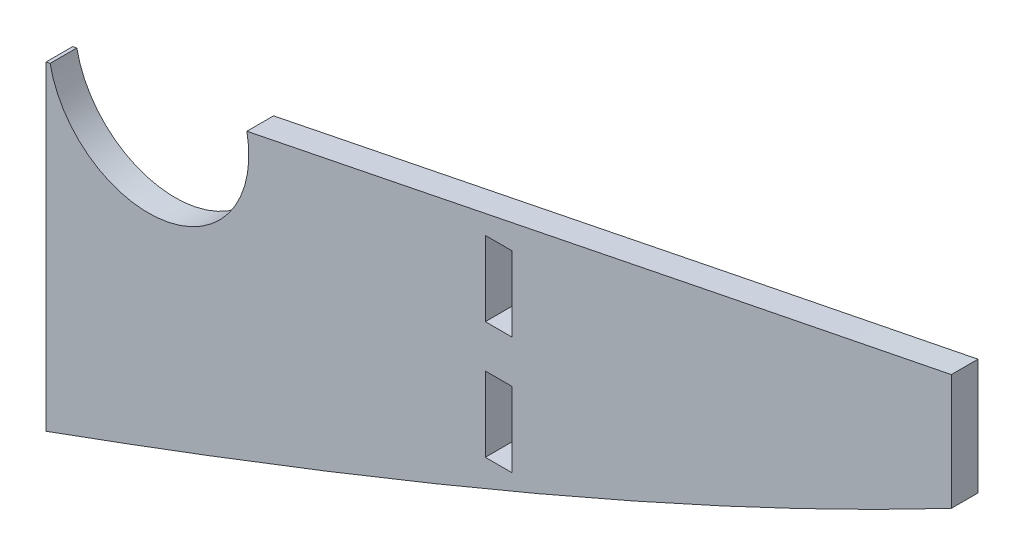
ISO-10303-21;
HEADER;
FILE_DESCRIPTION(('STEP AP214'),'2;1');
FILE_NAME('part.step','',(''),(''),'','','');
FILE_SCHEMA(('AUTOMOTIVE_DESIGN { 1 0 10303 214 1 1 1 1 }'));
ENDSEC;
DATA;
#1=APPLICATION_CONTEXT('core data for automotive mechanical design processes');
#2=APPLICATION_PROTOCOL_DEFINITION('international standard','automotive_design',2000,#1);
#3=PRODUCT_CONTEXT('',#1,'mechanical');
#4=PRODUCT('Part','Part','',(#3));
#5=PRODUCT_RELATED_PRODUCT_CATEGORY('part','',(#4));
#6=PRODUCT_DEFINITION_FORMATION('','',#4);
#7=PRODUCT_DEFINITION_CONTEXT('part definition',#1,'design');
#8=PRODUCT_DEFINITION('design','',#6,#7);
#9=PRODUCT_DEFINITION_SHAPE('','',#8);
#10=(LENGTH_UNIT() NAMED_UNIT(*) SI_UNIT(.MILLI.,.METRE.));
#11=(NAMED_UNIT(*) PLANE_ANGLE_UNIT() SI_UNIT($,.RADIAN.));
#12=(NAMED_UNIT(*) SI_UNIT($,.STERADIAN.) SOLID_ANGLE_UNIT());
#13=UNCERTAINTY_MEASURE_WITH_UNIT(LENGTH_MEASURE(1.E-05),#10,'distance_accuracy_value','');
#14=(GEOMETRIC_REPRESENTATION_CONTEXT(3) GLOBAL_UNCERTAINTY_ASSIGNED_CONTEXT((#13)) GLOBAL_UNIT_ASSIGNED_CONTEXT((#10,
#11,#12)) REPRESENTATION_CONTEXT('',''));
#15=CARTESIAN_POINT('',(0.,0.,0.));
#16=DIRECTION('',(0.,0.,1.));
#17=DIRECTION('',(1.,0.,0.));
#18=AXIS2_PLACEMENT_3D('',#15,#16,#17);
#19=CARTESIAN_POINT('',(374.396000000001,4.52327518462254E-12,-649.396489798407));
#20=DIRECTION('',(-1.,0.,0.));
#21=DIRECTION('',(0.,-1.,0.));
#22=AXIS2_PLACEMENT_3D('',#19,#20,#21);
#23=PLANE('',#22);
#24=DIRECTION('',(0.,1.,0.));
#25=VECTOR('',#24,1.);
#26=CARTESIAN_POINT('',(374.396000000001,4.52327518462254E-12,-652.571489798407));
#27=LINE('',#26,#25);
#28=CARTESIAN_POINT('',(374.396000000001,22.1319364735619,-652.571489798407));
#29=VERTEX_POINT('',#28);
#30=CARTESIAN_POINT('',(374.396000000001,35.9160765897987,-652.571489798407));
#31=VERTEX_POINT('',#30);
#32=EDGE_CURVE('E168',#29,#31,#27,.T.);
#33=ORIENTED_EDGE('',*,*,#32,.T.);
#34=DIRECTION('',(0.,0.,-1.));
#35=VECTOR('',#34,1.);
#36=CARTESIAN_POINT('',(374.396000000001,35.9160765897987,-649.396489798407));
#37=LINE('',#36,#35);
#38=CARTESIAN_POINT('',(374.396000000001,35.9160765897987,-649.396489798407));
#39=VERTEX_POINT('',#38);
#40=EDGE_CURVE('E290',#39,#31,#37,.T.);
#41=ORIENTED_EDGE('',*,*,#40,.F.);
#42=DIRECTION('',(0.,1.,0.));
#43=VECTOR('',#42,1.);
#44=CARTESIAN_POINT('',(374.396000000001,4.52327518462254E-12,-649.396489798407));
#45=LINE('',#44,#43);
#46=CARTESIAN_POINT('',(374.396000000001,22.1319364735619,-649.396489798407));
#47=VERTEX_POINT('',#46);
#48=EDGE_CURVE('E294',#47,#39,#45,.T.);
#49=ORIENTED_EDGE('',*,*,#48,.F.);
#50=DIRECTION('',(0.,0.,-1.));
#51=VECTOR('',#50,1.);
#52=CARTESIAN_POINT('',(374.396000000001,22.1319364735619,-649.396489798407));
#53=LINE('',#52,#51);
#54=EDGE_CURVE('E323',#47,#29,#53,.T.);
#55=ORIENTED_EDGE('',*,*,#54,.T.);
#56=EDGE_LOOP('',(#33,#41,#49,#55));
#57=FACE_BOUND('',#56,.T.);
#58=ADVANCED_FACE('F37',(#57),#23,.F.);
#59=CARTESIAN_POINT('',(374.396000000001,35.9160765897987,-649.396489798407));
#60=CARTESIAN_POINT('',(360.350473034592,33.1320534399722,-649.396489798407));
#61=CARTESIAN_POINT('',(346.312147582397,30.3120887584574,-649.396489798407));
#62=CARTESIAN_POINT('',(318.237676110703,24.6612822162992,-649.396489798407));
#63=CARTESIAN_POINT('',(304.201813174372,21.8290370005057,-649.396489798407));
#64=CARTESIAN_POINT('',(290.165193943975,19.0005565911736,-649.396489798407));
#65=B_SPLINE_CURVE_WITH_KNOTS('',3,(#59,#60,#61,#62,#63,#64),.UNSPECIFIED.,.F.,.F.,(4,2,4),(0.,
0.5,1.),.UNSPECIFIED.);
#66=DIRECTION('',(0.,0.,-1.));
#67=VECTOR('',#66,1.);
#68=SURFACE_OF_LINEAR_EXTRUSION('',#65,#67);
#69=CARTESIAN_POINT('',(374.396000000001,35.9160765897987,-652.571489798407));
#70=CARTESIAN_POINT('',(360.350473034592,33.1320534399722,-652.571489798407));
#71=CARTESIAN_POINT('',(346.312147582397,30.3120887584574,-652.571489798407));
#72=CARTESIAN_POINT('',(318.381505150183,24.6902320071463,-652.571489798407));
#73=CARTESIAN_POINT('',(304.489443265361,21.8870760724583,-652.571489798407));
#74=CARTESIAN_POINT('',(290.596661875897,19.0875017254489,-652.571489798407));
#75=B_SPLINE_CURVE_WITH_KNOTS('',3,(#69,#70,#71,#72,#73,#74),.UNSPECIFIED.,.F.,.F.,(4,2,4),(0.,
0.5,0.994876874543293),.UNSPECIFIED.);
#76=CARTESIAN_POINT('',(290.596661875897,19.087501725449,-652.571489798407));
#77=VERTEX_POINT('',#76);
#78=EDGE_CURVE('E227',#31,#77,#75,.T.);
#79=ORIENTED_EDGE('',*,*,#78,.T.);
#80=DIRECTION('',(0.,0.,-1.));
#81=VECTOR('',#80,1.);
#82=CARTESIAN_POINT('',(290.596661875897,19.087501725449,-649.396489798407));
#83=LINE('',#82,#81);
#84=CARTESIAN_POINT('',(290.596661875897,19.087501725449,-649.396489798407));
#85=VERTEX_POINT('',#84);
#86=EDGE_CURVE('E291',#85,#77,#83,.T.);
#87=ORIENTED_EDGE('',*,*,#86,.F.);
#88=CARTESIAN_POINT('',(290.596661875897,19.0875017254489,-649.396489798407));
#89=CARTESIAN_POINT('',(304.489443265361,21.8870760724583,-649.396489798407));
#90=CARTESIAN_POINT('',(318.381505150183,24.6902320071463,-649.396489798407));
#91=CARTESIAN_POINT('',(346.312147582397,30.3120887584574,-649.396489798407));
#92=CARTESIAN_POINT('',(360.350473034592,33.1320534399722,-649.396489798407));
#93=CARTESIAN_POINT('',(374.396000000001,35.9160765897987,-649.396489798407));
#94=B_SPLINE_CURVE_WITH_KNOTS('',3,(#88,#89,#90,#91,#92,#93),.UNSPECIFIED.,.F.,.F.,(4,2,4),(0.,
0.494876874543293,0.994876874543293),.UNSPECIFIED.);
#95=EDGE_CURVE('E280',#39,#85,#94,.F.);
#96=ORIENTED_EDGE('',*,*,#95,.F.);
#97=ORIENTED_EDGE('',*,*,#40,.T.);
#98=EDGE_LOOP('',(#79,#87,#96,#97));
#99=FACE_BOUND('',#98,.T.);
#100=ADVANCED_FACE('F198',(#99),#68,.F.);
#101=CARTESIAN_POINT('',(278.892,16.7387287753927,-649.396489798407));
#102=DIRECTION('',(0.,0.,-1.));
#103=DIRECTION('',(-1.,0.,0.));
#104=AXIS2_PLACEMENT_3D('',#101,#102,#103);
#105=CYLINDRICAL_SURFACE('',#104,11.9379999999999);
#106=CARTESIAN_POINT('',(278.892,16.7387287753927,-652.571489798407));
#107=DIRECTION('',(0.,0.,1.));
#108=DIRECTION('',(1.,0.,0.));
#109=AXIS2_PLACEMENT_3D('',#106,#107,#108);
#110=CIRCLE('',#109,11.9379999999999);
#111=CARTESIAN_POINT('',(267.190410106897,14.3746987473194,-652.571489798407));
#112=VERTEX_POINT('',#111);
#113=EDGE_CURVE('E233',#112,#77,#110,.T.);
#114=ORIENTED_EDGE('',*,*,#113,.F.);
#115=DIRECTION('',(0.,0.,-1.));
#116=VECTOR('',#115,1.);
#117=CARTESIAN_POINT('',(267.190410106897,14.3746987473194,-649.396489798407));
#118=LINE('',#117,#116);
#119=CARTESIAN_POINT('',(267.190410106897,14.3746987473194,-649.396489798407));
#120=VERTEX_POINT('',#119);
#121=EDGE_CURVE('E308',#120,#112,#118,.T.);
#122=ORIENTED_EDGE('',*,*,#121,.F.);
#123=CARTESIAN_POINT('',(278.892,16.7387287753927,-649.396489798407));
#124=DIRECTION('',(0.,0.,1.));
#125=DIRECTION('',(1.,0.,0.));
#126=AXIS2_PLACEMENT_3D('',#123,#124,#125);
#127=CIRCLE('',#126,11.9379999999999);
#128=EDGE_CURVE('E293',#120,#85,#127,.T.);
#129=ORIENTED_EDGE('',*,*,#128,.T.);
#130=ORIENTED_EDGE('',*,*,#86,.T.);
#131=EDGE_LOOP('',(#114,#122,#129,#130));
#132=FACE_BOUND('',#131,.T.);
#133=ADVANCED_FACE('F202',(#132),#105,.F.);
#134=CARTESIAN_POINT('',(7.61053053151351,-37.837072775815,-649.396489798407));
#135=DIRECTION('',(0.197190193023657,-0.980365252227604,0.));
#136=DIRECTION('',(0.980365252227604,0.197190193023657,0.));
#137=AXIS2_PLACEMENT_3D('',#134,#135,#136);
#138=PLANE('',#137);
#139=DIRECTION('',(-0.980365252227604,-0.197190193023657,0.));
#140=VECTOR('',#139,1.);
#141=CARTESIAN_POINT('',(7.61053053151351,-37.837072775815,-652.571489798407));
#142=LINE('',#141,#140);
#143=CARTESIAN_POINT('',(266.7,14.2760578954328,-652.571489798407));
#144=VERTEX_POINT('',#143);
#145=EDGE_CURVE('E269',#112,#144,#142,.T.);
#146=ORIENTED_EDGE('',*,*,#145,.T.);
#147=DIRECTION('',(0.,0.,-1.));
#148=VECTOR('',#147,1.);
#149=CARTESIAN_POINT('',(266.7,14.2760578954328,-649.396489798407));
#150=LINE('',#149,#148);
#151=CARTESIAN_POINT('',(266.7,14.2760578954328,-649.396489798407));
#152=VERTEX_POINT('',#151);
#153=EDGE_CURVE('E347',#152,#144,#150,.T.);
#154=ORIENTED_EDGE('',*,*,#153,.F.);
#155=DIRECTION('',(-0.980365252227604,-0.197190193023657,0.));
#156=VECTOR('',#155,1.);
#157=CARTESIAN_POINT('',(7.61053053151351,-37.837072775815,-649.396489798407));
#158=LINE('',#157,#156);
#159=EDGE_CURVE('E193',#120,#152,#158,.T.);
#160=ORIENTED_EDGE('',*,*,#159,.F.);
#161=ORIENTED_EDGE('',*,*,#121,.T.);
#162=EDGE_LOOP('',(#146,#154,#160,#161));
#163=FACE_BOUND('',#162,.T.);
#164=ADVANCED_FACE('F351',(#163),#138,.F.);
#165=CARTESIAN_POINT('',(266.7,0.,-649.396489798407));
#166=DIRECTION('',(-1.,0.,0.));
#167=DIRECTION('',(0.,0.,1.));
#168=AXIS2_PLACEMENT_3D('',#165,#166,#167);
#169=PLANE('',#168);
#170=DIRECTION('',(0.,1.,0.));
#171=VECTOR('',#170,1.);
#172=CARTESIAN_POINT('',(266.7,0.,-652.571489798407));
#173=LINE('',#172,#171);
#174=CARTESIAN_POINT('',(266.7,-23.769261631752,-652.571489798407));
#175=VERTEX_POINT('',#174);
#176=EDGE_CURVE('E260',#175,#144,#173,.T.);
#177=ORIENTED_EDGE('',*,*,#176,.F.);
#178=DIRECTION('',(0.,0.,-1.));
#179=VECTOR('',#178,1.);
#180=CARTESIAN_POINT('',(266.7,-23.769261631752,-649.396489798407));
#181=LINE('',#180,#179);
#182=CARTESIAN_POINT('',(266.7,-23.769261631752,-649.396489798407));
#183=VERTEX_POINT('',#182);
#184=EDGE_CURVE('E331',#183,#175,#181,.T.);
#185=ORIENTED_EDGE('',*,*,#184,.F.);
#186=DIRECTION('',(0.,1.,0.));
#187=VECTOR('',#186,1.);
#188=CARTESIAN_POINT('',(266.7,0.,-649.396489798407));
#189=LINE('',#188,#187);
#190=EDGE_CURVE('E317',#183,#152,#189,.T.);
#191=ORIENTED_EDGE('',*,*,#190,.T.);
#192=ORIENTED_EDGE('',*,*,#153,.T.);
#193=EDGE_LOOP('',(#177,#185,#191,#192));
#194=FACE_BOUND('',#193,.T.);
#195=ADVANCED_FACE('F346',(#194),#169,.T.);
#196=CARTESIAN_POINT('',(266.7,-23.769261631752,-649.396489798407));
#197=CARTESIAN_POINT('',(275.880532182127,-20.4430517243825,-649.396489798407));
#198=CARTESIAN_POINT('',(285.029484636465,-17.0322397564336,-649.396489798407));
#199=CARTESIAN_POINT('',(303.244718304319,-9.98975822289113,-649.396489798407));
#200=CARTESIAN_POINT('',(312.307576038333,-6.35963896248339,-649.396489798407));
#201=CARTESIAN_POINT('',(330.315283920343,1.18765823975831,-649.396489798407));
#202=CARTESIAN_POINT('',(339.262942890638,5.10598106115365,-649.396489798407));
#203=CARTESIAN_POINT('',(356.976752757424,13.3116283746656,-649.396489798407));
#204=CARTESIAN_POINT('',(365.744943517146,17.5995709812879,-649.396489798407));
#205=CARTESIAN_POINT('',(374.396000000001,22.1319364735619,-649.396489798407));
#206=B_SPLINE_CURVE_WITH_KNOTS('',3,(#196,#197,#198,#199,#200,#201,#202,#203,#204,#205),
.UNSPECIFIED.,.F.,.F.,(4,2,2,2,4),(0.,0.25,0.5,0.75,1.),.UNSPECIFIED.);
#207=DIRECTION('',(0.,0.,-1.));
#208=VECTOR('',#207,1.);
#209=SURFACE_OF_LINEAR_EXTRUSION('',#206,#208);
#210=CARTESIAN_POINT('',(266.7,-23.769261631752,-652.571489798407));
#211=CARTESIAN_POINT('',(275.880532182127,-20.4430517243825,-652.571489798407));
#212=CARTESIAN_POINT('',(285.029484636465,-17.0322397564336,-652.571489798407));
#213=CARTESIAN_POINT('',(303.244718304319,-9.98975822289113,-652.571489798407));
#214=CARTESIAN_POINT('',(312.307576038333,-6.35963896248339,-652.571489798407));
#215=CARTESIAN_POINT('',(330.315283920343,1.18765823975831,-652.571489798407));
#216=CARTESIAN_POINT('',(339.262942890638,5.10598106115365,-652.571489798407));
#217=CARTESIAN_POINT('',(356.976752757424,13.3116283746656,-652.571489798407));
#218=CARTESIAN_POINT('',(365.744943517146,17.5995709812879,-652.571489798407));
#219=CARTESIAN_POINT('',(374.396000000001,22.1319364735619,-652.571489798407));
#220=B_SPLINE_CURVE_WITH_KNOTS('',3,(#210,#211,#212,#213,#214,#215,#216,#217,#218,#219),
.UNSPECIFIED.,.F.,.F.,(4,2,2,2,4),(0.,0.25,0.5,0.75,1.),.UNSPECIFIED.);
#221=EDGE_CURVE('E268',#175,#29,#220,.T.);
#222=ORIENTED_EDGE('',*,*,#221,.T.);
#223=ORIENTED_EDGE('',*,*,#54,.F.);
#224=CARTESIAN_POINT('',(374.396000000001,22.1319364735619,-649.396489798407));
#225=CARTESIAN_POINT('',(365.744943517146,17.5995709812879,-649.396489798407));
#226=CARTESIAN_POINT('',(356.976752757424,13.3116283746656,-649.396489798407));
#227=CARTESIAN_POINT('',(339.262942890638,5.10598106115365,-649.396489798407));
#228=CARTESIAN_POINT('',(330.315283920343,1.18765823975831,-649.396489798407));
#229=CARTESIAN_POINT('',(312.307576038333,-6.35963896248339,-649.396489798407));
#230=CARTESIAN_POINT('',(303.244718304319,-9.98975822289113,-649.396489798407));
#231=CARTESIAN_POINT('',(285.029484636465,-17.0322397564336,-649.396489798407));
#232=CARTESIAN_POINT('',(275.880532182127,-20.4430517243825,-649.396489798407));
#233=CARTESIAN_POINT('',(266.7,-23.769261631752,-649.396489798407));
#234=B_SPLINE_CURVE_WITH_KNOTS('',3,(#224,#225,#226,#227,#228,#229,#230,#231,#232,#233),
.UNSPECIFIED.,.F.,.F.,(4,2,2,2,4),(0.,0.25,0.5,0.75,1.),.UNSPECIFIED.);
#235=EDGE_CURVE('E298',#183,#47,#234,.F.);
#236=ORIENTED_EDGE('',*,*,#235,.F.);
#237=ORIENTED_EDGE('',*,*,#184,.T.);
#238=EDGE_LOOP('',(#222,#223,#236,#237));
#239=FACE_BOUND('',#238,.T.);
#240=ADVANCED_FACE('F249',(#239),#209,.F.);
#241=CARTESIAN_POINT('',(0.,0.,-649.396489798407));
#242=DIRECTION('',(0.,0.,1.));
#243=DIRECTION('',(1.,0.,0.));
#244=AXIS2_PLACEMENT_3D('',#241,#242,#243);
#245=PLANE('',#244);
#246=DIRECTION('',(0.,-1.,0.));
#247=VECTOR('',#246,1.);
#248=CARTESIAN_POINT('',(318.9605,22.5396657683968,-649.396489798407));
#249=LINE('',#248,#247);
#250=CARTESIAN_POINT('',(318.9605,22.5396657683968,-649.396489798407));
#251=VERTEX_POINT('',#250);
#252=CARTESIAN_POINT('',(318.9605,13.6496657683968,-649.396489798407));
#253=VERTEX_POINT('',#252);
#254=EDGE_CURVE('E51',#251,#253,#249,.T.);
#255=ORIENTED_EDGE('',*,*,#254,.F.);
#256=DIRECTION('',(-1.,0.,0.));
#257=VECTOR('',#256,1.);
#258=CARTESIAN_POINT('',(318.9605,22.5396657683968,-649.396489798407));
#259=LINE('',#258,#257);
#260=CARTESIAN_POINT('',(322.1355,22.5396657683968,-649.396489798407));
#261=VERTEX_POINT('',#260);
#262=EDGE_CURVE('E161',#261,#251,#259,.T.);
#263=ORIENTED_EDGE('',*,*,#262,.F.);
#264=DIRECTION('',(0.,1.,0.));
#265=VECTOR('',#264,1.);
#266=CARTESIAN_POINT('',(322.1355,22.5396657683968,-649.396489798407));
#267=LINE('',#266,#265);
#268=CARTESIAN_POINT('',(322.1355,13.6496657683968,-649.396489798407));
#269=VERTEX_POINT('',#268);
#270=EDGE_CURVE('E144',#269,#261,#267,.T.);
#271=ORIENTED_EDGE('',*,*,#270,.F.);
#272=DIRECTION('',(1.,0.,0.));
#273=VECTOR('',#272,1.);
#274=CARTESIAN_POINT('',(318.9605,13.6496657683968,-649.396489798407));
#275=LINE('',#274,#273);
#276=EDGE_CURVE('E154',#253,#269,#275,.T.);
#277=ORIENTED_EDGE('',*,*,#276,.F.);
#278=EDGE_LOOP('',(#255,#263,#271,#277));
#279=FACE_BOUND('',#278,.T.);
#280=DIRECTION('',(0.,-1.,0.));
#281=VECTOR('',#280,1.);
#282=CARTESIAN_POINT('',(318.9605,8.56966576839677,-649.396489798407));
#283=LINE('',#282,#281);
#284=CARTESIAN_POINT('',(318.9605,8.56966576839677,-649.396489798407));
#285=VERTEX_POINT('',#284);
#286=CARTESIAN_POINT('',(318.9605,-0.320334231603232,-649.396489798407));
#287=VERTEX_POINT('',#286);
#288=EDGE_CURVE('E59',#285,#287,#283,.T.);
#289=ORIENTED_EDGE('',*,*,#288,.F.);
#290=DIRECTION('',(-1.,0.,0.));
#291=VECTOR('',#290,1.);
#292=CARTESIAN_POINT('',(318.9605,8.56966576839677,-649.396489798407));
#293=LINE('',#292,#291);
#294=CARTESIAN_POINT('',(322.1355,8.56966576839677,-649.396489798407));
#295=VERTEX_POINT('',#294);
#296=EDGE_CURVE('E178',#295,#285,#293,.T.);
#297=ORIENTED_EDGE('',*,*,#296,.F.);
#298=DIRECTION('',(0.,1.,0.));
#299=VECTOR('',#298,1.);
#300=CARTESIAN_POINT('',(322.1355,8.56966576839677,-649.396489798407));
#301=LINE('',#300,#299);
#302=CARTESIAN_POINT('',(322.1355,-0.320334231603232,-649.396489798407));
#303=VERTEX_POINT('',#302);
#304=EDGE_CURVE('E175',#303,#295,#301,.T.);
#305=ORIENTED_EDGE('',*,*,#304,.F.);
#306=DIRECTION('',(1.,0.,0.));
#307=VECTOR('',#306,1.);
#308=CARTESIAN_POINT('',(318.9605,-0.320334231603232,-649.396489798407));
#309=LINE('',#308,#307);
#310=EDGE_CURVE('E172',#287,#303,#309,.T.);
#311=ORIENTED_EDGE('',*,*,#310,.F.);
#312=EDGE_LOOP('',(#289,#297,#305,#311));
#313=FACE_BOUND('',#312,.T.);
#314=ORIENTED_EDGE('',*,*,#48,.T.);
#315=ORIENTED_EDGE('',*,*,#95,.T.);
#316=ORIENTED_EDGE('',*,*,#128,.F.);
#317=ORIENTED_EDGE('',*,*,#159,.T.);
#318=ORIENTED_EDGE('',*,*,#190,.F.);
#319=ORIENTED_EDGE('',*,*,#235,.T.);
#320=EDGE_LOOP('',(#314,#315,#316,#317,#318,#319));
#321=FACE_BOUND('',#320,.T.);
#322=ADVANCED_FACE('F158',(#279,#313,#321),#245,.T.);
#323=CARTESIAN_POINT('',(0.,0.,-652.571489798407));
#324=DIRECTION('',(0.,0.,1.));
#325=DIRECTION('',(1.,0.,0.));
#326=AXIS2_PLACEMENT_3D('',#323,#324,#325);
#327=PLANE('',#326);
#328=DIRECTION('',(-1.,0.,0.));
#329=VECTOR('',#328,1.);
#330=CARTESIAN_POINT('',(0.,22.5396657683964,-652.571489798407));
#331=LINE('',#330,#329);
#332=CARTESIAN_POINT('',(322.1355,22.5396657683968,-652.571489798407));
#333=VERTEX_POINT('',#332);
#334=CARTESIAN_POINT('',(318.9605,22.5396657683968,-652.571489798407));
#335=VERTEX_POINT('',#334);
#336=EDGE_CURVE('E44',#333,#335,#331,.T.);
#337=ORIENTED_EDGE('',*,*,#336,.T.);
#338=DIRECTION('',(0.,-1.,0.));
#339=VECTOR('',#338,1.);
#340=CARTESIAN_POINT('',(318.9605,0.,-652.571489798407));
#341=LINE('',#340,#339);
#342=CARTESIAN_POINT('',(318.9605,13.6496657683968,-652.571489798407));
#343=VERTEX_POINT('',#342);
#344=EDGE_CURVE('E11',#335,#343,#341,.T.);
#345=ORIENTED_EDGE('',*,*,#344,.T.);
#346=DIRECTION('',(1.,0.,0.));
#347=VECTOR('',#346,1.);
#348=CARTESIAN_POINT('',(0.,13.6496657683968,-652.571489798407));
#349=LINE('',#348,#347);
#350=CARTESIAN_POINT('',(322.1355,13.6496657683968,-652.571489798407));
#351=VERTEX_POINT('',#350);
#352=EDGE_CURVE('E505',#343,#351,#349,.T.);
#353=ORIENTED_EDGE('',*,*,#352,.T.);
#354=DIRECTION('',(0.,1.,0.));
#355=VECTOR('',#354,1.);
#356=CARTESIAN_POINT('',(322.1355,0.,-652.571489798407));
#357=LINE('',#356,#355);
#358=EDGE_CURVE('E147',#351,#333,#357,.T.);
#359=ORIENTED_EDGE('',*,*,#358,.T.);
#360=EDGE_LOOP('',(#337,#345,#353,#359));
#361=FACE_BOUND('',#360,.T.);
#362=DIRECTION('',(-1.,0.,0.));
#363=VECTOR('',#362,1.);
#364=CARTESIAN_POINT('',(0.,8.56966576839677,-652.571489798407));
#365=LINE('',#364,#363);
#366=CARTESIAN_POINT('',(322.1355,8.56966576839677,-652.571489798407));
#367=VERTEX_POINT('',#366);
#368=CARTESIAN_POINT('',(318.9605,8.56966576839677,-652.571489798407));
#369=VERTEX_POINT('',#368);
#370=EDGE_CURVE('E512',#367,#369,#365,.T.);
#371=ORIENTED_EDGE('',*,*,#370,.T.);
#372=DIRECTION('',(0.,-1.,0.));
#373=VECTOR('',#372,1.);
#374=CARTESIAN_POINT('',(318.9605,0.,-652.571489798407));
#375=LINE('',#374,#373);
#376=CARTESIAN_POINT('',(318.9605,-0.320334231603232,-652.571489798407));
#377=VERTEX_POINT('',#376);
#378=EDGE_CURVE('E507',#369,#377,#375,.T.);
#379=ORIENTED_EDGE('',*,*,#378,.T.);
#380=DIRECTION('',(1.,0.,0.));
#381=VECTOR('',#380,1.);
#382=CARTESIAN_POINT('',(0.,-0.320334231603232,-652.571489798407));
#383=LINE('',#382,#381);
#384=CARTESIAN_POINT('',(322.1355,-0.320334231603232,-652.571489798407));
#385=VERTEX_POINT('',#384);
#386=EDGE_CURVE('E304',#377,#385,#383,.T.);
#387=ORIENTED_EDGE('',*,*,#386,.T.);
#388=DIRECTION('',(0.,1.,0.));
#389=VECTOR('',#388,1.);
#390=CARTESIAN_POINT('',(322.1355,0.,-652.571489798407));
#391=LINE('',#390,#389);
#392=EDGE_CURVE('E306',#385,#367,#391,.T.);
#393=ORIENTED_EDGE('',*,*,#392,.T.);
#394=EDGE_LOOP('',(#371,#379,#387,#393));
#395=FACE_BOUND('',#394,.T.);
#396=ORIENTED_EDGE('',*,*,#32,.F.);
#397=ORIENTED_EDGE('',*,*,#221,.F.);
#398=ORIENTED_EDGE('',*,*,#176,.T.);
#399=ORIENTED_EDGE('',*,*,#145,.F.);
#400=ORIENTED_EDGE('',*,*,#113,.T.);
#401=ORIENTED_EDGE('',*,*,#78,.F.);
#402=EDGE_LOOP('',(#396,#397,#398,#399,#400,#401));
#403=FACE_BOUND('',#402,.T.);
#404=ADVANCED_FACE('F235',(#361,#395,#403),#327,.F.);
#405=CARTESIAN_POINT('',(318.9605,8.56966576839677,-652.576489798407));
#406=DIRECTION('',(-1.,0.,0.));
#407=DIRECTION('',(0.,0.,1.));
#408=AXIS2_PLACEMENT_3D('',#405,#406,#407);
#409=PLANE('',#408);
#410=DIRECTION('',(0.,0.,1.));
#411=VECTOR('',#410,1.);
#412=CARTESIAN_POINT('',(318.9605,8.56966576839677,-652.576489798407));
#413=LINE('',#412,#411);
#414=EDGE_CURVE('E182',#369,#285,#413,.T.);
#415=ORIENTED_EDGE('',*,*,#414,.T.);
#416=ORIENTED_EDGE('',*,*,#288,.T.);
#417=DIRECTION('',(0.,0.,1.));
#418=VECTOR('',#417,1.);
#419=CARTESIAN_POINT('',(318.9605,-0.320334231603232,-652.576489798407));
#420=LINE('',#419,#418);
#421=EDGE_CURVE('E181',#377,#287,#420,.T.);
#422=ORIENTED_EDGE('',*,*,#421,.F.);
#423=ORIENTED_EDGE('',*,*,#378,.F.);
#424=EDGE_LOOP('',(#415,#416,#422,#423));
#425=FACE_BOUND('',#424,.T.);
#426=ADVANCED_FACE('F245',(#425),#409,.F.);
#427=CARTESIAN_POINT('',(318.9605,8.56966576839677,-652.576489798407));
#428=DIRECTION('',(0.,1.,0.));
#429=DIRECTION('',(0.,0.,1.));
#430=AXIS2_PLACEMENT_3D('',#427,#428,#429);
#431=PLANE('',#430);
#432=DIRECTION('',(0.,0.,1.));
#433=VECTOR('',#432,1.);
#434=CARTESIAN_POINT('',(322.1355,8.56966576839677,-652.576489798407));
#435=LINE('',#434,#433);
#436=EDGE_CURVE('E184',#367,#295,#435,.T.);
#437=ORIENTED_EDGE('',*,*,#436,.T.);
#438=ORIENTED_EDGE('',*,*,#296,.T.);
#439=ORIENTED_EDGE('',*,*,#414,.F.);
#440=ORIENTED_EDGE('',*,*,#370,.F.);
#441=EDGE_LOOP('',(#437,#438,#439,#440));
#442=FACE_BOUND('',#441,.T.);
#443=ADVANCED_FACE('F435',(#442),#431,.F.);
#444=CARTESIAN_POINT('',(322.1355,8.56966576839677,-652.576489798407));
#445=DIRECTION('',(1.,0.,0.));
#446=DIRECTION('',(0.,0.,-1.));
#447=AXIS2_PLACEMENT_3D('',#444,#445,#446);
#448=PLANE('',#447);
#449=DIRECTION('',(0.,0.,1.));
#450=VECTOR('',#449,1.);
#451=CARTESIAN_POINT('',(322.1355,-0.320334231603232,-652.576489798407));
#452=LINE('',#451,#450);
#453=EDGE_CURVE('E186',#385,#303,#452,.T.);
#454=ORIENTED_EDGE('',*,*,#453,.T.);
#455=ORIENTED_EDGE('',*,*,#304,.T.);
#456=ORIENTED_EDGE('',*,*,#436,.F.);
#457=ORIENTED_EDGE('',*,*,#392,.F.);
#458=EDGE_LOOP('',(#454,#455,#456,#457));
#459=FACE_BOUND('',#458,.T.);
#460=ADVANCED_FACE('F443',(#459),#448,.F.);
#461=CARTESIAN_POINT('',(318.9605,-0.320334231603232,-652.576489798407));
#462=DIRECTION('',(0.,-1.,0.));
#463=DIRECTION('',(0.,0.,-1.));
#464=AXIS2_PLACEMENT_3D('',#461,#462,#463);
#465=PLANE('',#464);
#466=ORIENTED_EDGE('',*,*,#421,.T.);
#467=ORIENTED_EDGE('',*,*,#310,.T.);
#468=ORIENTED_EDGE('',*,*,#453,.F.);
#469=ORIENTED_EDGE('',*,*,#386,.F.);
#470=EDGE_LOOP('',(#466,#467,#468,#469));
#471=FACE_BOUND('',#470,.T.);
#472=ADVANCED_FACE('F453',(#471),#465,.F.);
#473=CARTESIAN_POINT('',(318.9605,22.5396657683968,-652.576489798407));
#474=DIRECTION('',(-1.,0.,0.));
#475=DIRECTION('',(0.,0.,1.));
#476=AXIS2_PLACEMENT_3D('',#473,#474,#475);
#477=PLANE('',#476);
#478=DIRECTION('',(0.,0.,1.));
#479=VECTOR('',#478,1.);
#480=CARTESIAN_POINT('',(318.9605,22.5396657683968,-652.576489798407));
#481=LINE('',#480,#479);
#482=EDGE_CURVE('E166',#335,#251,#481,.T.);
#483=ORIENTED_EDGE('',*,*,#482,.T.);
#484=ORIENTED_EDGE('',*,*,#254,.T.);
#485=DIRECTION('',(0.,0.,1.));
#486=VECTOR('',#485,1.);
#487=CARTESIAN_POINT('',(318.9605,13.6496657683968,-652.576489798407));
#488=LINE('',#487,#486);
#489=EDGE_CURVE('E151',#343,#253,#488,.T.);
#490=ORIENTED_EDGE('',*,*,#489,.F.);
#491=ORIENTED_EDGE('',*,*,#344,.F.);
#492=EDGE_LOOP('',(#483,#484,#490,#491));
#493=FACE_BOUND('',#492,.T.);
#494=ADVANCED_FACE('F463',(#493),#477,.F.);
#495=CARTESIAN_POINT('',(318.9605,22.5396657683968,-652.576489798407));
#496=DIRECTION('',(0.,1.,0.));
#497=DIRECTION('',(-1.,0.,0.));
#498=AXIS2_PLACEMENT_3D('',#495,#496,#497);
#499=PLANE('',#498);
#500=DIRECTION('',(0.,0.,1.));
#501=VECTOR('',#500,1.);
#502=CARTESIAN_POINT('',(322.1355,22.5396657683968,-652.576489798407));
#503=LINE('',#502,#501);
#504=EDGE_CURVE('E150',#333,#261,#503,.T.);
#505=ORIENTED_EDGE('',*,*,#504,.T.);
#506=ORIENTED_EDGE('',*,*,#262,.T.);
#507=ORIENTED_EDGE('',*,*,#482,.F.);
#508=ORIENTED_EDGE('',*,*,#336,.F.);
#509=EDGE_LOOP('',(#505,#506,#507,#508));
#510=FACE_BOUND('',#509,.T.);
#511=ADVANCED_FACE('F473',(#510),#499,.F.);
#512=CARTESIAN_POINT('',(322.1355,22.5396657683968,-652.576489798407));
#513=DIRECTION('',(1.,0.,0.));
#514=DIRECTION('',(0.,0.,-1.));
#515=AXIS2_PLACEMENT_3D('',#512,#513,#514);
#516=PLANE('',#515);
#517=DIRECTION('',(0.,0.,1.));
#518=VECTOR('',#517,1.);
#519=CARTESIAN_POINT('',(322.1355,13.6496657683968,-652.576489798407));
#520=LINE('',#519,#518);
#521=EDGE_CURVE('E139',#351,#269,#520,.T.);
#522=ORIENTED_EDGE('',*,*,#521,.T.);
#523=ORIENTED_EDGE('',*,*,#270,.T.);
#524=ORIENTED_EDGE('',*,*,#504,.F.);
#525=ORIENTED_EDGE('',*,*,#358,.F.);
#526=EDGE_LOOP('',(#522,#523,#524,#525));
#527=FACE_BOUND('',#526,.T.);
#528=ADVANCED_FACE('F141',(#527),#516,.F.);
#529=CARTESIAN_POINT('',(318.9605,13.6496657683968,-652.576489798407));
#530=DIRECTION('',(0.,-1.,0.));
#531=DIRECTION('',(0.,0.,-1.));
#532=AXIS2_PLACEMENT_3D('',#529,#530,#531);
#533=PLANE('',#532);
#534=ORIENTED_EDGE('',*,*,#489,.T.);
#535=ORIENTED_EDGE('',*,*,#276,.T.);
#536=ORIENTED_EDGE('',*,*,#521,.F.);
#537=ORIENTED_EDGE('',*,*,#352,.F.);
#538=EDGE_LOOP('',(#534,#535,#536,#537));
#539=FACE_BOUND('',#538,.T.);
#540=ADVANCED_FACE('F155',(#539),#533,.F.);
#541=CLOSED_SHELL('',(#58,#100,#133,#164,#195,#240,#322,#404,#426,#443,#460,#472,#494,#511,#528,#540));
#542=MANIFOLD_SOLID_BREP('B2',#541);
#543=ADVANCED_BREP_SHAPE_REPRESENTATION('',(#18,#542),#14);
#544=SHAPE_DEFINITION_REPRESENTATION(#9,#543);
ENDSEC;
END-ISO-10303-21;
